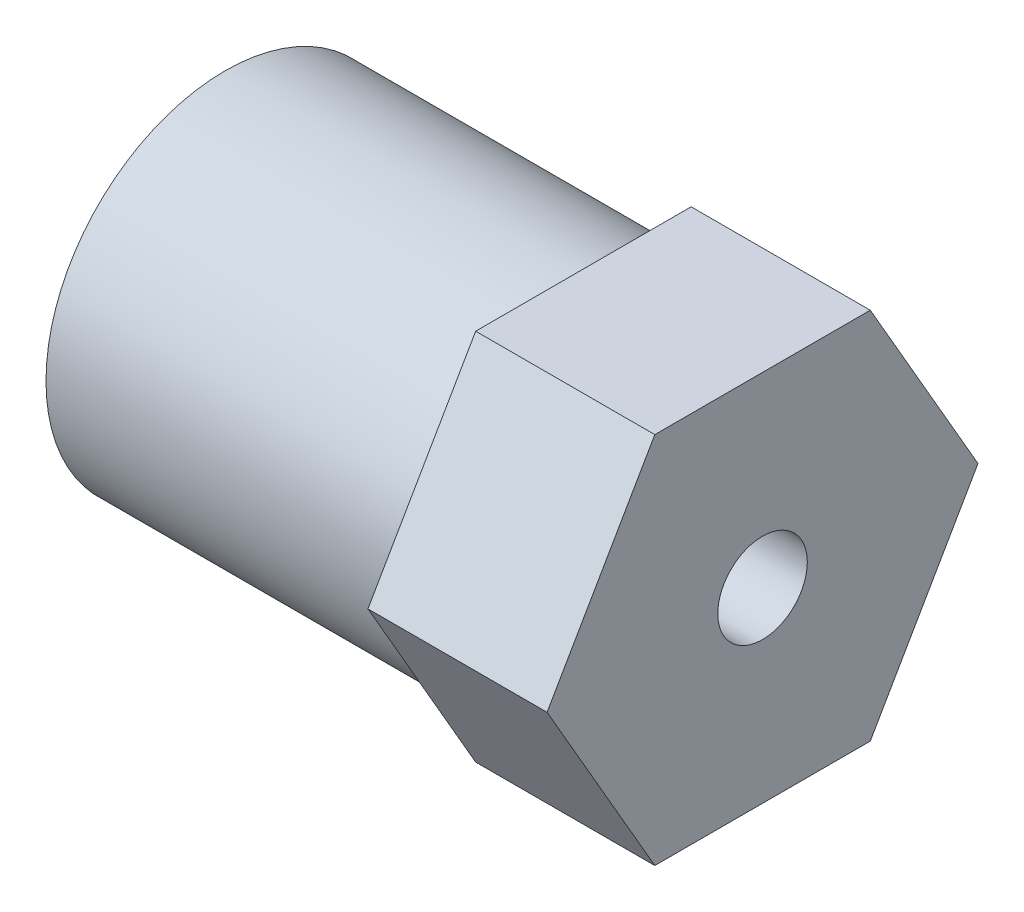
ISO-10303-21;
HEADER;
FILE_DESCRIPTION(('STEP AP214'),'2;1');
FILE_NAME('part.step','',(''),(''),'','','');
FILE_SCHEMA(('AUTOMOTIVE_DESIGN { 1 0 10303 214 1 1 1 1 }'));
ENDSEC;
DATA;
#1=APPLICATION_CONTEXT('core data for automotive mechanical design processes');
#2=APPLICATION_PROTOCOL_DEFINITION('international standard','automotive_design',2000,#1);
#3=PRODUCT_CONTEXT('',#1,'mechanical');
#4=PRODUCT('Part','Part','',(#3));
#5=PRODUCT_RELATED_PRODUCT_CATEGORY('part','',(#4));
#6=PRODUCT_DEFINITION_FORMATION('','',#4);
#7=PRODUCT_DEFINITION_CONTEXT('part definition',#1,'design');
#8=PRODUCT_DEFINITION('design','',#6,#7);
#9=PRODUCT_DEFINITION_SHAPE('','',#8);
#10=(LENGTH_UNIT() NAMED_UNIT(*) SI_UNIT(.MILLI.,.METRE.));
#11=(NAMED_UNIT(*) PLANE_ANGLE_UNIT() SI_UNIT($,.RADIAN.));
#12=(NAMED_UNIT(*) SI_UNIT($,.STERADIAN.) SOLID_ANGLE_UNIT());
#13=UNCERTAINTY_MEASURE_WITH_UNIT(LENGTH_MEASURE(1.E-05),#10,'distance_accuracy_value','');
#14=(GEOMETRIC_REPRESENTATION_CONTEXT(3) GLOBAL_UNCERTAINTY_ASSIGNED_CONTEXT((#13)) GLOBAL_UNIT_ASSIGNED_CONTEXT((#10,
#11,#12)) REPRESENTATION_CONTEXT('',''));
#15=CARTESIAN_POINT('',(0.,0.,0.));
#16=DIRECTION('',(0.,0.,1.));
#17=DIRECTION('',(1.,0.,0.));
#18=AXIS2_PLACEMENT_3D('',#15,#16,#17);
#19=CARTESIAN_POINT('',(6.,-6.25,-3.60843918243516));
#20=DIRECTION('',(0.,0.5,0.866025403784438));
#21=DIRECTION('',(0.,-0.866025403784439,0.5));
#22=AXIS2_PLACEMENT_3D('',#19,#20,#21);
#23=PLANE('',#22);
#24=DIRECTION('',(0.,0.866025403784439,-0.5));
#25=VECTOR('',#24,1.);
#26=CARTESIAN_POINT('',(0.,-6.25,-3.60843918243516));
#27=LINE('',#26,#25);
#28=CARTESIAN_POINT('',(0.,-6.25,-3.60843918243516));
#29=VERTEX_POINT('',#28);
#30=CARTESIAN_POINT('',(0.,0.,-7.21687836487033));
#31=VERTEX_POINT('',#30);
#32=EDGE_CURVE('E136',#29,#31,#27,.T.);
#33=ORIENTED_EDGE('',*,*,#32,.T.);
#34=DIRECTION('',(-1.,0.,0.));
#35=VECTOR('',#34,1.);
#36=CARTESIAN_POINT('',(6.,0.,-7.21687836487033));
#37=LINE('',#36,#35);
#38=CARTESIAN_POINT('',(6.,0.,-7.21687836487033));
#39=VERTEX_POINT('',#38);
#40=EDGE_CURVE('E55',#39,#31,#37,.T.);
#41=ORIENTED_EDGE('',*,*,#40,.F.);
#42=DIRECTION('',(0.,0.866025403784439,-0.5));
#43=VECTOR('',#42,1.);
#44=CARTESIAN_POINT('',(6.,-6.25,-3.60843918243516));
#45=LINE('',#44,#43);
#46=CARTESIAN_POINT('',(6.,-6.25,-3.60843918243516));
#47=VERTEX_POINT('',#46);
#48=EDGE_CURVE('E153',#47,#39,#45,.T.);
#49=ORIENTED_EDGE('',*,*,#48,.F.);
#50=DIRECTION('',(-1.,0.,0.));
#51=VECTOR('',#50,1.);
#52=CARTESIAN_POINT('',(6.,-6.25,-3.60843918243516));
#53=LINE('',#52,#51);
#54=EDGE_CURVE('E132',#47,#29,#53,.T.);
#55=ORIENTED_EDGE('',*,*,#54,.T.);
#56=EDGE_LOOP('',(#33,#41,#49,#55));
#57=FACE_BOUND('',#56,.T.);
#58=ADVANCED_FACE('F45',(#57),#23,.F.);
#59=CARTESIAN_POINT('',(6.,0.,-7.21687836487033));
#60=DIRECTION('',(0.,-0.5,0.866025403784438));
#61=DIRECTION('',(0.,-0.866025403784439,-0.5));
#62=AXIS2_PLACEMENT_3D('',#59,#60,#61);
#63=PLANE('',#62);
#64=DIRECTION('',(0.,0.866025403784439,0.5));
#65=VECTOR('',#64,1.);
#66=CARTESIAN_POINT('',(0.,0.,-7.21687836487033));
#67=LINE('',#66,#65);
#68=CARTESIAN_POINT('',(0.,6.25,-3.60843918243516));
#69=VERTEX_POINT('',#68);
#70=EDGE_CURVE('E140',#31,#69,#67,.T.);
#71=ORIENTED_EDGE('',*,*,#70,.T.);
#72=DIRECTION('',(-1.,0.,0.));
#73=VECTOR('',#72,1.);
#74=CARTESIAN_POINT('',(6.,6.25,-3.60843918243516));
#75=LINE('',#74,#73);
#76=CARTESIAN_POINT('',(6.,6.25,-3.60843918243516));
#77=VERTEX_POINT('',#76);
#78=EDGE_CURVE('E160',#77,#69,#75,.T.);
#79=ORIENTED_EDGE('',*,*,#78,.F.);
#80=DIRECTION('',(0.,0.866025403784439,0.5));
#81=VECTOR('',#80,1.);
#82=CARTESIAN_POINT('',(6.,0.,-7.21687836487033));
#83=LINE('',#82,#81);
#84=EDGE_CURVE('E101',#39,#77,#83,.T.);
#85=ORIENTED_EDGE('',*,*,#84,.F.);
#86=ORIENTED_EDGE('',*,*,#40,.T.);
#87=EDGE_LOOP('',(#71,#79,#85,#86));
#88=FACE_BOUND('',#87,.T.);
#89=ADVANCED_FACE('F166',(#88),#63,.F.);
#90=CARTESIAN_POINT('',(6.,6.25,-3.60843918243516));
#91=DIRECTION('',(0.,-1.,0.));
#92=DIRECTION('',(0.,0.,-1.));
#93=AXIS2_PLACEMENT_3D('',#90,#91,#92);
#94=PLANE('',#93);
#95=DIRECTION('',(0.,0.,1.));
#96=VECTOR('',#95,1.);
#97=CARTESIAN_POINT('',(0.,6.25,-3.60843918243516));
#98=LINE('',#97,#96);
#99=CARTESIAN_POINT('',(0.,6.25,3.60843918243516));
#100=VERTEX_POINT('',#99);
#101=EDGE_CURVE('E144',#69,#100,#98,.T.);
#102=ORIENTED_EDGE('',*,*,#101,.T.);
#103=DIRECTION('',(-1.,0.,0.));
#104=VECTOR('',#103,1.);
#105=CARTESIAN_POINT('',(6.,6.25,3.60843918243516));
#106=LINE('',#105,#104);
#107=CARTESIAN_POINT('',(6.,6.25,3.60843918243516));
#108=VERTEX_POINT('',#107);
#109=EDGE_CURVE('E125',#108,#100,#106,.T.);
#110=ORIENTED_EDGE('',*,*,#109,.F.);
#111=DIRECTION('',(0.,0.,1.));
#112=VECTOR('',#111,1.);
#113=CARTESIAN_POINT('',(6.,6.25,-3.60843918243516));
#114=LINE('',#113,#112);
#115=EDGE_CURVE('E114',#77,#108,#114,.T.);
#116=ORIENTED_EDGE('',*,*,#115,.F.);
#117=ORIENTED_EDGE('',*,*,#78,.T.);
#118=EDGE_LOOP('',(#102,#110,#116,#117));
#119=FACE_BOUND('',#118,.T.);
#120=ADVANCED_FACE('F174',(#119),#94,.F.);
#121=CARTESIAN_POINT('',(6.,6.25,3.60843918243516));
#122=DIRECTION('',(0.,-0.5,-0.866025403784439));
#123=DIRECTION('',(0.,0.866025403784439,-0.5));
#124=AXIS2_PLACEMENT_3D('',#121,#122,#123);
#125=PLANE('',#124);
#126=DIRECTION('',(0.,-0.866025403784438,0.5));
#127=VECTOR('',#126,1.);
#128=CARTESIAN_POINT('',(0.,6.25,3.60843918243516));
#129=LINE('',#128,#127);
#130=CARTESIAN_POINT('',(0.,0.,7.21687836487032));
#131=VERTEX_POINT('',#130);
#132=EDGE_CURVE('E123',#100,#131,#129,.T.);
#133=ORIENTED_EDGE('',*,*,#132,.T.);
#134=DIRECTION('',(-1.,0.,0.));
#135=VECTOR('',#134,1.);
#136=CARTESIAN_POINT('',(6.,0.,7.21687836487032));
#137=LINE('',#136,#135);
#138=CARTESIAN_POINT('',(6.,0.,7.21687836487032));
#139=VERTEX_POINT('',#138);
#140=EDGE_CURVE('E120',#139,#131,#137,.T.);
#141=ORIENTED_EDGE('',*,*,#140,.F.);
#142=DIRECTION('',(0.,-0.866025403784438,0.5));
#143=VECTOR('',#142,1.);
#144=CARTESIAN_POINT('',(6.,6.25,3.60843918243516));
#145=LINE('',#144,#143);
#146=EDGE_CURVE('E108',#108,#139,#145,.T.);
#147=ORIENTED_EDGE('',*,*,#146,.F.);
#148=ORIENTED_EDGE('',*,*,#109,.T.);
#149=EDGE_LOOP('',(#133,#141,#147,#148));
#150=FACE_BOUND('',#149,.T.);
#151=ADVANCED_FACE('F121',(#150),#125,.F.);
#152=CARTESIAN_POINT('',(6.,0.,7.21687836487032));
#153=DIRECTION('',(0.,0.5,-0.866025403784438));
#154=DIRECTION('',(0.,0.866025403784438,0.5));
#155=AXIS2_PLACEMENT_3D('',#152,#153,#154);
#156=PLANE('',#155);
#157=DIRECTION('',(0.,-0.866025403784438,-0.5));
#158=VECTOR('',#157,1.);
#159=CARTESIAN_POINT('',(0.,0.,7.21687836487032));
#160=LINE('',#159,#158);
#161=CARTESIAN_POINT('',(0.,-6.25,3.60843918243516));
#162=VERTEX_POINT('',#161);
#163=EDGE_CURVE('E86',#131,#162,#160,.T.);
#164=ORIENTED_EDGE('',*,*,#163,.T.);
#165=DIRECTION('',(-1.,0.,0.));
#166=VECTOR('',#165,1.);
#167=CARTESIAN_POINT('',(6.,-6.25,3.60843918243516));
#168=LINE('',#167,#166);
#169=CARTESIAN_POINT('',(6.,-6.25,3.60843918243516));
#170=VERTEX_POINT('',#169);
#171=EDGE_CURVE('E126',#170,#162,#168,.T.);
#172=ORIENTED_EDGE('',*,*,#171,.F.);
#173=DIRECTION('',(0.,-0.866025403784438,-0.5));
#174=VECTOR('',#173,1.);
#175=CARTESIAN_POINT('',(6.,0.,7.21687836487032));
#176=LINE('',#175,#174);
#177=EDGE_CURVE('E112',#139,#170,#176,.T.);
#178=ORIENTED_EDGE('',*,*,#177,.F.);
#179=ORIENTED_EDGE('',*,*,#140,.T.);
#180=EDGE_LOOP('',(#164,#172,#178,#179));
#181=FACE_BOUND('',#180,.T.);
#182=ADVANCED_FACE('F128',(#181),#156,.F.);
#183=CARTESIAN_POINT('',(6.,-6.25,3.60843918243516));
#184=DIRECTION('',(0.,1.,0.));
#185=DIRECTION('',(0.,0.,1.));
#186=AXIS2_PLACEMENT_3D('',#183,#184,#185);
#187=PLANE('',#186);
#188=DIRECTION('',(0.,0.,-1.));
#189=VECTOR('',#188,1.);
#190=CARTESIAN_POINT('',(0.,-6.25,3.60843918243516));
#191=LINE('',#190,#189);
#192=EDGE_CURVE('E92',#162,#29,#191,.T.);
#193=ORIENTED_EDGE('',*,*,#192,.T.);
#194=ORIENTED_EDGE('',*,*,#54,.F.);
#195=DIRECTION('',(0.,0.,-1.));
#196=VECTOR('',#195,1.);
#197=CARTESIAN_POINT('',(6.,-6.25,3.60843918243516));
#198=LINE('',#197,#196);
#199=EDGE_CURVE('E63',#170,#47,#198,.T.);
#200=ORIENTED_EDGE('',*,*,#199,.F.);
#201=ORIENTED_EDGE('',*,*,#171,.T.);
#202=EDGE_LOOP('',(#193,#194,#200,#201));
#203=FACE_BOUND('',#202,.T.);
#204=ADVANCED_FACE('F233',(#203),#187,.F.);
#205=CARTESIAN_POINT('',(6.,0.,0.));
#206=DIRECTION('',(1.,0.,0.));
#207=DIRECTION('',(0.,0.,-1.));
#208=AXIS2_PLACEMENT_3D('',#205,#206,#207);
#209=PLANE('',#208);
#210=CARTESIAN_POINT('',(6.,0.,0.));
#211=DIRECTION('',(1.,0.,0.));
#212=DIRECTION('',(0.,0.,-1.));
#213=AXIS2_PLACEMENT_3D('',#210,#211,#212);
#214=CIRCLE('',#213,1.5);
#215=CARTESIAN_POINT('',(6.,0.,-1.5));
#216=VERTEX_POINT('',#215);
#217=EDGE_CURVE('E192',#216,#216,#214,.T.);
#218=ORIENTED_EDGE('',*,*,#217,.F.);
#219=EDGE_LOOP('',(#218));
#220=FACE_BOUND('',#219,.T.);
#221=ORIENTED_EDGE('',*,*,#48,.T.);
#222=ORIENTED_EDGE('',*,*,#84,.T.);
#223=ORIENTED_EDGE('',*,*,#115,.T.);
#224=ORIENTED_EDGE('',*,*,#146,.T.);
#225=ORIENTED_EDGE('',*,*,#177,.T.);
#226=ORIENTED_EDGE('',*,*,#199,.T.);
#227=EDGE_LOOP('',(#221,#222,#223,#224,#225,#226));
#228=FACE_BOUND('',#227,.T.);
#229=ADVANCED_FACE('F110',(#220,#228),#209,.T.);
#230=CARTESIAN_POINT('',(0.,0.,0.));
#231=DIRECTION('',(1.,0.,0.));
#232=DIRECTION('',(0.,0.,-1.));
#233=AXIS2_PLACEMENT_3D('',#230,#231,#232);
#234=PLANE('',#233);
#235=CARTESIAN_POINT('',(0.,0.,0.));
#236=DIRECTION('',(1.,0.,0.));
#237=DIRECTION('',(0.,0.,-1.));
#238=AXIS2_PLACEMENT_3D('',#235,#236,#237);
#239=CIRCLE('',#238,6.);
#240=CARTESIAN_POINT('',(0.,0.,-6.));
#241=VERTEX_POINT('',#240);
#242=EDGE_CURVE('E11',#241,#241,#239,.F.);
#243=ORIENTED_EDGE('',*,*,#242,.F.);
#244=EDGE_LOOP('',(#243));
#245=FACE_BOUND('',#244,.T.);
#246=ORIENTED_EDGE('',*,*,#32,.F.);
#247=ORIENTED_EDGE('',*,*,#192,.F.);
#248=ORIENTED_EDGE('',*,*,#163,.F.);
#249=ORIENTED_EDGE('',*,*,#132,.F.);
#250=ORIENTED_EDGE('',*,*,#101,.F.);
#251=ORIENTED_EDGE('',*,*,#70,.F.);
#252=EDGE_LOOP('',(#246,#247,#248,#249,#250,#251));
#253=FACE_BOUND('',#252,.T.);
#254=ADVANCED_FACE('F171',(#245,#253),#234,.F.);
#255=CARTESIAN_POINT('',(-12.,0.,0.));
#256=DIRECTION('',(1.,0.,0.));
#257=DIRECTION('',(0.,0.,-1.));
#258=AXIS2_PLACEMENT_3D('',#255,#256,#257);
#259=CYLINDRICAL_SURFACE('',#258,6.);
#260=CARTESIAN_POINT('',(-12.,0.,0.));
#261=DIRECTION('',(-1.,0.,0.));
#262=DIRECTION('',(0.,0.,1.));
#263=AXIS2_PLACEMENT_3D('',#260,#261,#262);
#264=CIRCLE('',#263,6.);
#265=CARTESIAN_POINT('',(-12.,0.,6.));
#266=VERTEX_POINT('',#265);
#267=EDGE_CURVE('E141',#266,#266,#264,.T.);
#268=ORIENTED_EDGE('',*,*,#267,.F.);
#269=EDGE_LOOP('',(#268));
#270=FACE_BOUND('',#269,.T.);
#271=ORIENTED_EDGE('',*,*,#242,.T.);
#272=EDGE_LOOP('',(#271));
#273=FACE_BOUND('',#272,.T.);
#274=ADVANCED_FACE('F218',(#270,#273),#259,.T.);
#275=CARTESIAN_POINT('',(-12.,0.,0.));
#276=DIRECTION('',(-1.,0.,0.));
#277=DIRECTION('',(0.,0.,1.));
#278=AXIS2_PLACEMENT_3D('',#275,#276,#277);
#279=PLANE('',#278);
#280=CARTESIAN_POINT('',(-12.,0.,0.));
#281=DIRECTION('',(-1.,0.,0.));
#282=DIRECTION('',(0.,0.,1.));
#283=AXIS2_PLACEMENT_3D('',#280,#281,#282);
#284=CIRCLE('',#283,3.);
#285=CARTESIAN_POINT('',(-12.,0.,3.));
#286=VERTEX_POINT('',#285);
#287=EDGE_CURVE('E185',#286,#286,#284,.T.);
#288=ORIENTED_EDGE('',*,*,#287,.F.);
#289=EDGE_LOOP('',(#288));
#290=FACE_BOUND('',#289,.T.);
#291=ORIENTED_EDGE('',*,*,#267,.T.);
#292=EDGE_LOOP('',(#291));
#293=FACE_BOUND('',#292,.T.);
#294=ADVANCED_FACE('F212',(#290,#293),#279,.T.);
#295=CARTESIAN_POINT('',(0.,0.,0.));
#296=DIRECTION('',(-1.,0.,0.));
#297=DIRECTION('',(0.,0.,1.));
#298=AXIS2_PLACEMENT_3D('',#295,#296,#297);
#299=CYLINDRICAL_SURFACE('',#298,3.);
#300=CARTESIAN_POINT('',(0.,0.,0.));
#301=DIRECTION('',(-1.,0.,0.));
#302=DIRECTION('',(0.,0.,1.));
#303=AXIS2_PLACEMENT_3D('',#300,#301,#302);
#304=CIRCLE('',#303,3.);
#305=CARTESIAN_POINT('',(0.,0.,3.));
#306=VERTEX_POINT('',#305);
#307=EDGE_CURVE('E184',#306,#306,#304,.T.);
#308=ORIENTED_EDGE('',*,*,#307,.F.);
#309=EDGE_LOOP('',(#308));
#310=FACE_BOUND('',#309,.T.);
#311=ORIENTED_EDGE('',*,*,#287,.T.);
#312=EDGE_LOOP('',(#311));
#313=FACE_BOUND('',#312,.T.);
#314=ADVANCED_FACE('F206',(#310,#313),#299,.F.);
#315=CARTESIAN_POINT('',(0.,0.,0.));
#316=DIRECTION('',(-1.,0.,0.));
#317=DIRECTION('',(0.,0.,1.));
#318=AXIS2_PLACEMENT_3D('',#315,#316,#317);
#319=PLANE('',#318);
#320=CARTESIAN_POINT('',(0.,0.,0.));
#321=DIRECTION('',(-1.,0.,0.));
#322=DIRECTION('',(0.,0.,1.));
#323=AXIS2_PLACEMENT_3D('',#320,#321,#322);
#324=CIRCLE('',#323,1.5);
#325=CARTESIAN_POINT('',(0.,0.,1.5));
#326=VERTEX_POINT('',#325);
#327=EDGE_CURVE('E48',#326,#326,#324,.T.);
#328=ORIENTED_EDGE('',*,*,#327,.F.);
#329=EDGE_LOOP('',(#328));
#330=FACE_BOUND('',#329,.T.);
#331=ORIENTED_EDGE('',*,*,#307,.T.);
#332=EDGE_LOOP('',(#331));
#333=FACE_BOUND('',#332,.T.);
#334=ADVANCED_FACE('F203',(#330,#333),#319,.T.);
#335=CARTESIAN_POINT('',(-12.,0.,0.));
#336=DIRECTION('',(1.,0.,0.));
#337=DIRECTION('',(0.,0.,-1.));
#338=AXIS2_PLACEMENT_3D('',#335,#336,#337);
#339=CYLINDRICAL_SURFACE('',#338,1.5);
#340=ORIENTED_EDGE('',*,*,#327,.T.);
#341=EDGE_LOOP('',(#340));
#342=FACE_BOUND('',#341,.T.);
#343=ORIENTED_EDGE('',*,*,#217,.T.);
#344=EDGE_LOOP('',(#343));
#345=FACE_BOUND('',#344,.T.);
#346=ADVANCED_FACE('F201',(#342,#345),#339,.F.);
#347=CLOSED_SHELL('',(#58,#89,#120,#151,#182,#204,#229,#254,#274,#294,#314,#334,#346));
#348=MANIFOLD_SOLID_BREP('B2',#347);
#349=ADVANCED_BREP_SHAPE_REPRESENTATION('',(#18,#348),#14);
#350=SHAPE_DEFINITION_REPRESENTATION(#9,#349);
ENDSEC;
END-ISO-10303-21;
